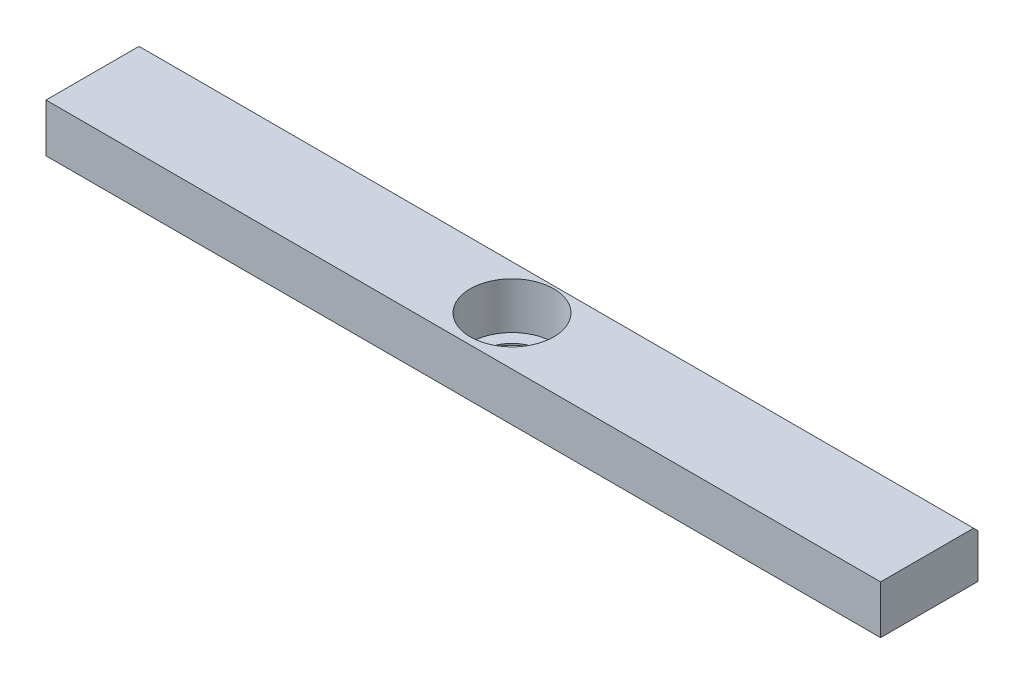
ISO-10303-21;
HEADER;
FILE_DESCRIPTION(('STEP AP214'),'2;1');
FILE_NAME('part.step','',(''),(''),'','','');
FILE_SCHEMA(('AUTOMOTIVE_DESIGN { 1 0 10303 214 1 1 1 1 }'));
ENDSEC;
DATA;
#1=APPLICATION_CONTEXT('core data for automotive mechanical design processes');
#2=APPLICATION_PROTOCOL_DEFINITION('international standard','automotive_design',2000,#1);
#3=PRODUCT_CONTEXT('',#1,'mechanical');
#4=PRODUCT('Part','Part','',(#3));
#5=PRODUCT_RELATED_PRODUCT_CATEGORY('part','',(#4));
#6=PRODUCT_DEFINITION_FORMATION('','',#4);
#7=PRODUCT_DEFINITION_CONTEXT('part definition',#1,'design');
#8=PRODUCT_DEFINITION('design','',#6,#7);
#9=PRODUCT_DEFINITION_SHAPE('','',#8);
#10=(LENGTH_UNIT() NAMED_UNIT(*) SI_UNIT(.MILLI.,.METRE.));
#11=(NAMED_UNIT(*) PLANE_ANGLE_UNIT() SI_UNIT($,.RADIAN.));
#12=(NAMED_UNIT(*) SI_UNIT($,.STERADIAN.) SOLID_ANGLE_UNIT());
#13=UNCERTAINTY_MEASURE_WITH_UNIT(LENGTH_MEASURE(1.E-05),#10,'distance_accuracy_value','');
#14=(GEOMETRIC_REPRESENTATION_CONTEXT(3) GLOBAL_UNCERTAINTY_ASSIGNED_CONTEXT((#13)) GLOBAL_UNIT_ASSIGNED_CONTEXT((#10,
#11,#12)) REPRESENTATION_CONTEXT('',''));
#15=CARTESIAN_POINT('',(0.,0.,0.));
#16=DIRECTION('',(0.,0.,1.));
#17=DIRECTION('',(1.,0.,0.));
#18=AXIS2_PLACEMENT_3D('',#15,#16,#17);
#19=CARTESIAN_POINT('',(-475.,27.5,55.4323445171847));
#20=DIRECTION('',(1.,0.,0.));
#21=DIRECTION('',(0.,0.,-1.));
#22=AXIS2_PLACEMENT_3D('',#19,#20,#21);
#23=PLANE('',#22);
#24=DIRECTION('',(0.,0.,1.));
#25=VECTOR('',#24,1.);
#26=CARTESIAN_POINT('',(-475.,27.5,55.4323445171847));
#27=LINE('',#26,#25);
#28=CARTESIAN_POINT('',(-475.,27.5,-50.4323445171847));
#29=VERTEX_POINT('',#28);
#30=CARTESIAN_POINT('',(-475.,27.5,55.4323445171847));
#31=VERTEX_POINT('',#30);
#32=EDGE_CURVE('E86',#29,#31,#27,.T.);
#33=ORIENTED_EDGE('',*,*,#32,.F.);
#34=DIRECTION('',(0.,-0.707106781186548,-0.707106781186548));
#35=VECTOR('',#34,1.);
#36=CARTESIAN_POINT('',(-475.,27.5,-50.4323445171847));
#37=LINE('',#36,#35);
#38=CARTESIAN_POINT('',(-475.,22.5,-55.4323445171847));
#39=VERTEX_POINT('',#38);
#40=EDGE_CURVE('E64',#29,#39,#37,.T.);
#41=ORIENTED_EDGE('',*,*,#40,.T.);
#42=DIRECTION('',(0.,-1.,0.));
#43=VECTOR('',#42,1.);
#44=CARTESIAN_POINT('',(-475.,27.5,-55.4323445171847));
#45=LINE('',#44,#43);
#46=CARTESIAN_POINT('',(-475.,-27.5,-55.4323445171847));
#47=VERTEX_POINT('',#46);
#48=EDGE_CURVE('E133',#39,#47,#45,.T.);
#49=ORIENTED_EDGE('',*,*,#48,.T.);
#50=DIRECTION('',(0.,0.,1.));
#51=VECTOR('',#50,1.);
#52=CARTESIAN_POINT('',(-475.,-27.5,55.4323445171847));
#53=LINE('',#52,#51);
#54=CARTESIAN_POINT('',(-475.,-27.5,55.4323445171847));
#55=VERTEX_POINT('',#54);
#56=EDGE_CURVE('E108',#47,#55,#53,.T.);
#57=ORIENTED_EDGE('',*,*,#56,.T.);
#58=DIRECTION('',(0.,-1.,0.));
#59=VECTOR('',#58,1.);
#60=CARTESIAN_POINT('',(-475.,27.5,55.4323445171847));
#61=LINE('',#60,#59);
#62=EDGE_CURVE('E100',#31,#55,#61,.T.);
#63=ORIENTED_EDGE('',*,*,#62,.F.);
#64=EDGE_LOOP('',(#33,#41,#49,#57,#63));
#65=FACE_BOUND('',#64,.T.);
#66=ADVANCED_FACE('F41',(#65),#23,.F.);
#67=CARTESIAN_POINT('',(475.,27.5,55.4323445171847));
#68=DIRECTION('',(0.,0.,-1.));
#69=DIRECTION('',(-1.,0.,0.));
#70=AXIS2_PLACEMENT_3D('',#67,#68,#69);
#71=PLANE('',#70);
#72=DIRECTION('',(1.,0.,0.));
#73=VECTOR('',#72,1.);
#74=CARTESIAN_POINT('',(475.,-27.5,55.4323445171847));
#75=LINE('',#74,#73);
#76=CARTESIAN_POINT('',(475.,-27.5,55.4323445171847));
#77=VERTEX_POINT('',#76);
#78=EDGE_CURVE('E135',#55,#77,#75,.T.);
#79=ORIENTED_EDGE('',*,*,#78,.T.);
#80=DIRECTION('',(0.,-1.,0.));
#81=VECTOR('',#80,1.);
#82=CARTESIAN_POINT('',(475.,27.5,55.4323445171847));
#83=LINE('',#82,#81);
#84=CARTESIAN_POINT('',(475.,27.5,55.4323445171847));
#85=VERTEX_POINT('',#84);
#86=EDGE_CURVE('E103',#85,#77,#83,.T.);
#87=ORIENTED_EDGE('',*,*,#86,.F.);
#88=DIRECTION('',(1.,0.,0.));
#89=VECTOR('',#88,1.);
#90=CARTESIAN_POINT('',(475.,27.5,55.4323445171847));
#91=LINE('',#90,#89);
#92=EDGE_CURVE('E90',#31,#85,#91,.T.);
#93=ORIENTED_EDGE('',*,*,#92,.F.);
#94=ORIENTED_EDGE('',*,*,#62,.T.);
#95=EDGE_LOOP('',(#79,#87,#93,#94));
#96=FACE_BOUND('',#95,.T.);
#97=ADVANCED_FACE('F99',(#96),#71,.F.);
#98=CARTESIAN_POINT('',(475.,27.5,55.4323445171847));
#99=DIRECTION('',(-1.,0.,0.));
#100=DIRECTION('',(0.,0.,1.));
#101=AXIS2_PLACEMENT_3D('',#98,#99,#100);
#102=PLANE('',#101);
#103=DIRECTION('',(0.,-1.,0.));
#104=VECTOR('',#103,1.);
#105=CARTESIAN_POINT('',(475.,27.5,-55.4323445171847));
#106=LINE('',#105,#104);
#107=CARTESIAN_POINT('',(475.,22.5,-55.4323445171847));
#108=VERTEX_POINT('',#107);
#109=CARTESIAN_POINT('',(475.,-27.5,-55.4323445171847));
#110=VERTEX_POINT('',#109);
#111=EDGE_CURVE('E111',#108,#110,#106,.T.);
#112=ORIENTED_EDGE('',*,*,#111,.F.);
#113=DIRECTION('',(0.,0.707106781186548,0.707106781186548));
#114=VECTOR('',#113,1.);
#115=CARTESIAN_POINT('',(475.,27.5,-50.4323445171847));
#116=LINE('',#115,#114);
#117=CARTESIAN_POINT('',(475.,27.5,-50.4323445171847));
#118=VERTEX_POINT('',#117);
#119=EDGE_CURVE('E11',#108,#118,#116,.T.);
#120=ORIENTED_EDGE('',*,*,#119,.T.);
#121=DIRECTION('',(0.,0.,-1.));
#122=VECTOR('',#121,1.);
#123=CARTESIAN_POINT('',(475.,27.5,55.4323445171847));
#124=LINE('',#123,#122);
#125=EDGE_CURVE('E105',#85,#118,#124,.T.);
#126=ORIENTED_EDGE('',*,*,#125,.F.);
#127=ORIENTED_EDGE('',*,*,#86,.T.);
#128=DIRECTION('',(0.,0.,-1.));
#129=VECTOR('',#128,1.);
#130=CARTESIAN_POINT('',(475.,-27.5,55.4323445171847));
#131=LINE('',#130,#129);
#132=EDGE_CURVE('E137',#77,#110,#131,.T.);
#133=ORIENTED_EDGE('',*,*,#132,.T.);
#134=EDGE_LOOP('',(#112,#120,#126,#127,#133));
#135=FACE_BOUND('',#134,.T.);
#136=ADVANCED_FACE('F147',(#135),#102,.F.);
#137=CARTESIAN_POINT('',(475.,27.5,-55.4323445171847));
#138=DIRECTION('',(0.,0.,1.));
#139=DIRECTION('',(1.,0.,0.));
#140=AXIS2_PLACEMENT_3D('',#137,#138,#139);
#141=PLANE('',#140);
#142=ORIENTED_EDGE('',*,*,#48,.F.);
#143=DIRECTION('',(1.,0.,0.));
#144=VECTOR('',#143,1.);
#145=CARTESIAN_POINT('',(475.,22.5,-55.4323445171847));
#146=LINE('',#145,#144);
#147=EDGE_CURVE('E50',#39,#108,#146,.T.);
#148=ORIENTED_EDGE('',*,*,#147,.T.);
#149=ORIENTED_EDGE('',*,*,#111,.T.);
#150=DIRECTION('',(-1.,0.,0.));
#151=VECTOR('',#150,1.);
#152=CARTESIAN_POINT('',(475.,-27.5,-55.4323445171847));
#153=LINE('',#152,#151);
#154=EDGE_CURVE('E95',#110,#47,#153,.T.);
#155=ORIENTED_EDGE('',*,*,#154,.T.);
#156=EDGE_LOOP('',(#142,#148,#149,#155));
#157=FACE_BOUND('',#156,.T.);
#158=ADVANCED_FACE('F142',(#157),#141,.F.);
#159=CARTESIAN_POINT('',(0.,27.5,0.));
#160=DIRECTION('',(0.,1.,0.));
#161=DIRECTION('',(0.,0.,1.));
#162=AXIS2_PLACEMENT_3D('',#159,#160,#161);
#163=PLANE('',#162);
#164=CARTESIAN_POINT('',(0.,27.5,0.));
#165=DIRECTION('',(0.,1.,0.));
#166=DIRECTION('',(0.,0.,1.));
#167=AXIS2_PLACEMENT_3D('',#164,#165,#166);
#168=CIRCLE('',#167,47.5);
#169=CARTESIAN_POINT('',(0.,27.5,47.5));
#170=VERTEX_POINT('',#169);
#171=EDGE_CURVE('E117',#170,#170,#168,.T.);
#172=ORIENTED_EDGE('',*,*,#171,.F.);
#173=EDGE_LOOP('',(#172));
#174=FACE_BOUND('',#173,.T.);
#175=ORIENTED_EDGE('',*,*,#125,.T.);
#176=DIRECTION('',(-1.,0.,0.));
#177=VECTOR('',#176,1.);
#178=CARTESIAN_POINT('',(-475.,27.5,-50.4323445171847));
#179=LINE('',#178,#177);
#180=EDGE_CURVE('E93',#118,#29,#179,.T.);
#181=ORIENTED_EDGE('',*,*,#180,.T.);
#182=ORIENTED_EDGE('',*,*,#32,.T.);
#183=ORIENTED_EDGE('',*,*,#92,.T.);
#184=EDGE_LOOP('',(#175,#181,#182,#183));
#185=FACE_BOUND('',#184,.T.);
#186=ADVANCED_FACE('F89',(#174,#185),#163,.T.);
#187=CARTESIAN_POINT('',(0.,-27.5,0.));
#188=DIRECTION('',(0.,1.,0.));
#189=DIRECTION('',(0.,0.,1.));
#190=AXIS2_PLACEMENT_3D('',#187,#188,#189);
#191=PLANE('',#190);
#192=CARTESIAN_POINT('',(0.,-27.5,0.));
#193=DIRECTION('',(0.,1.,0.));
#194=DIRECTION('',(0.,0.,1.));
#195=AXIS2_PLACEMENT_3D('',#192,#193,#194);
#196=CIRCLE('',#195,32.5);
#197=CARTESIAN_POINT('',(0.,-27.5,32.5));
#198=VERTEX_POINT('',#197);
#199=EDGE_CURVE('E115',#198,#198,#196,.T.);
#200=ORIENTED_EDGE('',*,*,#199,.T.);
#201=EDGE_LOOP('',(#200));
#202=FACE_BOUND('',#201,.T.);
#203=ORIENTED_EDGE('',*,*,#56,.F.);
#204=ORIENTED_EDGE('',*,*,#154,.F.);
#205=ORIENTED_EDGE('',*,*,#132,.F.);
#206=ORIENTED_EDGE('',*,*,#78,.F.);
#207=EDGE_LOOP('',(#203,#204,#205,#206));
#208=FACE_BOUND('',#207,.T.);
#209=ADVANCED_FACE('F149',(#202,#208),#191,.F.);
#210=CARTESIAN_POINT('',(0.,-25.5,0.));
#211=DIRECTION('',(0.,1.,0.));
#212=DIRECTION('',(0.,0.,1.));
#213=AXIS2_PLACEMENT_3D('',#210,#211,#212);
#214=CYLINDRICAL_SURFACE('',#213,47.5);
#215=CARTESIAN_POINT('',(0.,-25.5,0.));
#216=DIRECTION('',(0.,1.,0.));
#217=DIRECTION('',(0.,0.,1.));
#218=AXIS2_PLACEMENT_3D('',#215,#216,#217);
#219=CIRCLE('',#218,47.5);
#220=CARTESIAN_POINT('',(0.,-25.5,47.5));
#221=VERTEX_POINT('',#220);
#222=EDGE_CURVE('E123',#221,#221,#219,.T.);
#223=ORIENTED_EDGE('',*,*,#222,.F.);
#224=EDGE_LOOP('',(#223));
#225=FACE_BOUND('',#224,.T.);
#226=ORIENTED_EDGE('',*,*,#171,.T.);
#227=EDGE_LOOP('',(#226));
#228=FACE_BOUND('',#227,.T.);
#229=ADVANCED_FACE('F151',(#225,#228),#214,.F.);
#230=CARTESIAN_POINT('',(0.,-25.5,0.));
#231=DIRECTION('',(0.,1.,0.));
#232=DIRECTION('',(0.,0.,1.));
#233=AXIS2_PLACEMENT_3D('',#230,#231,#232);
#234=PLANE('',#233);
#235=CARTESIAN_POINT('',(0.,-25.5,0.));
#236=DIRECTION('',(0.,1.,0.));
#237=DIRECTION('',(0.,0.,1.));
#238=AXIS2_PLACEMENT_3D('',#235,#236,#237);
#239=CIRCLE('',#238,32.5);
#240=CARTESIAN_POINT('',(0.,-25.5,32.5));
#241=VERTEX_POINT('',#240);
#242=EDGE_CURVE('E118',#241,#241,#239,.T.);
#243=ORIENTED_EDGE('',*,*,#242,.F.);
#244=EDGE_LOOP('',(#243));
#245=FACE_BOUND('',#244,.T.);
#246=ORIENTED_EDGE('',*,*,#222,.T.);
#247=EDGE_LOOP('',(#246));
#248=FACE_BOUND('',#247,.T.);
#249=ADVANCED_FACE('F157',(#245,#248),#234,.T.);
#250=CARTESIAN_POINT('',(0.,-78.5,0.));
#251=DIRECTION('',(0.,1.,0.));
#252=DIRECTION('',(0.,0.,1.));
#253=AXIS2_PLACEMENT_3D('',#250,#251,#252);
#254=CYLINDRICAL_SURFACE('',#253,32.5);
#255=ORIENTED_EDGE('',*,*,#242,.T.);
#256=EDGE_LOOP('',(#255));
#257=FACE_BOUND('',#256,.T.);
#258=ORIENTED_EDGE('',*,*,#199,.F.);
#259=EDGE_LOOP('',(#258));
#260=FACE_BOUND('',#259,.T.);
#261=ADVANCED_FACE('F188',(#257,#260),#254,.F.);
#262=CARTESIAN_POINT('',(0.,27.5,-50.4323445171847));
#263=DIRECTION('',(0.,0.707106781186547,-0.707106781186547));
#264=DIRECTION('',(1.,0.,0.));
#265=AXIS2_PLACEMENT_3D('',#262,#263,#264);
#266=PLANE('',#265);
#267=ORIENTED_EDGE('',*,*,#119,.F.);
#268=ORIENTED_EDGE('',*,*,#147,.F.);
#269=ORIENTED_EDGE('',*,*,#40,.F.);
#270=ORIENTED_EDGE('',*,*,#180,.F.);
#271=EDGE_LOOP('',(#267,#268,#269,#270));
#272=FACE_BOUND('',#271,.T.);
#273=ADVANCED_FACE('F44',(#272),#266,.T.);
#274=CLOSED_SHELL('',(#66,#97,#136,#158,#186,#209,#229,#249,#261,#273));
#275=MANIFOLD_SOLID_BREP('B2',#274);
#276=ADVANCED_BREP_SHAPE_REPRESENTATION('',(#18,#275),#14);
#277=SHAPE_DEFINITION_REPRESENTATION(#9,#276);
ENDSEC;
END-ISO-10303-21;
